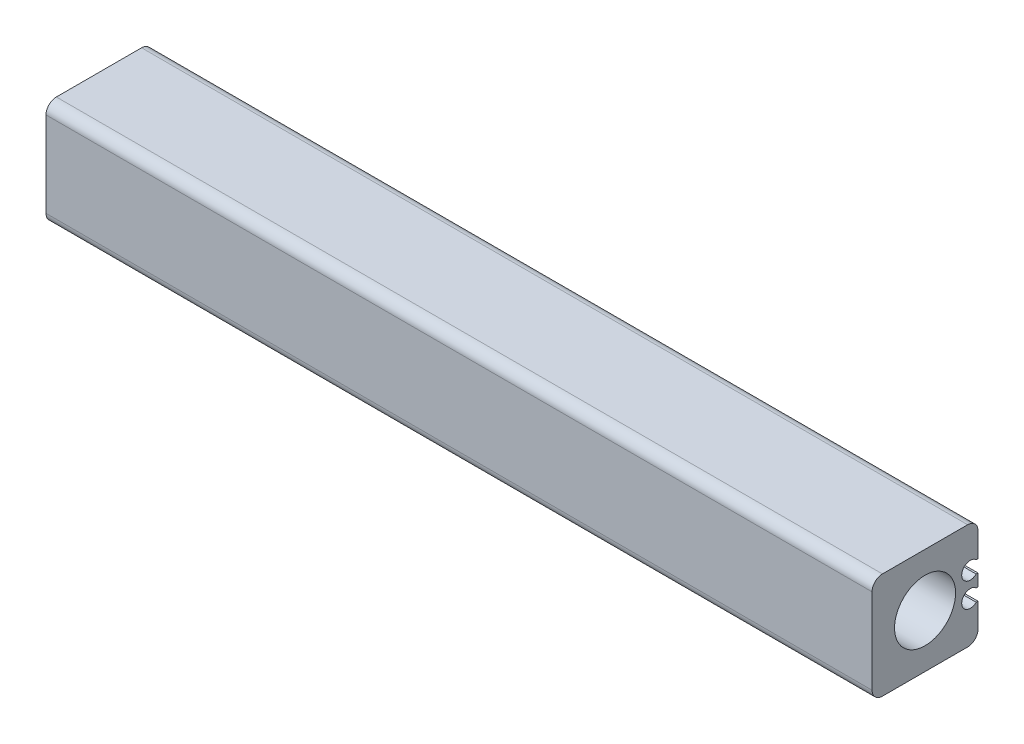
ISO-10303-21;
HEADER;
FILE_DESCRIPTION(('STEP AP214'),'2;1');
FILE_NAME('part.step','',(''),(''),'','','');
FILE_SCHEMA(('AUTOMOTIVE_DESIGN { 1 0 10303 214 1 1 1 1 }'));
ENDSEC;
DATA;
#1=APPLICATION_CONTEXT('core data for automotive mechanical design processes');
#2=APPLICATION_PROTOCOL_DEFINITION('international standard','automotive_design',2000,#1);
#3=PRODUCT_CONTEXT('',#1,'mechanical');
#4=PRODUCT('Part','Part','',(#3));
#5=PRODUCT_RELATED_PRODUCT_CATEGORY('part','',(#4));
#6=PRODUCT_DEFINITION_FORMATION('','',#4);
#7=PRODUCT_DEFINITION_CONTEXT('part definition',#1,'design');
#8=PRODUCT_DEFINITION('design','',#6,#7);
#9=PRODUCT_DEFINITION_SHAPE('','',#8);
#10=(LENGTH_UNIT() NAMED_UNIT(*) SI_UNIT(.MILLI.,.METRE.));
#11=(NAMED_UNIT(*) PLANE_ANGLE_UNIT() SI_UNIT($,.RADIAN.));
#12=(NAMED_UNIT(*) SI_UNIT($,.STERADIAN.) SOLID_ANGLE_UNIT());
#13=UNCERTAINTY_MEASURE_WITH_UNIT(LENGTH_MEASURE(1.E-05),#10,'distance_accuracy_value','');
#14=(GEOMETRIC_REPRESENTATION_CONTEXT(3) GLOBAL_UNCERTAINTY_ASSIGNED_CONTEXT((#13)) GLOBAL_UNIT_ASSIGNED_CONTEXT((#10,
#11,#12)) REPRESENTATION_CONTEXT('',''));
#15=CARTESIAN_POINT('',(0.,0.,0.));
#16=DIRECTION('',(0.,0.,1.));
#17=DIRECTION('',(1.,0.,0.));
#18=AXIS2_PLACEMENT_3D('',#15,#16,#17);
#19=CARTESIAN_POINT('',(101.393625,13.,-13.));
#20=DIRECTION('',(0.,0.,1.));
#21=DIRECTION('',(0.,-1.,0.));
#22=AXIS2_PLACEMENT_3D('',#19,#20,#21);
#23=PLANE('',#22);
#24=DIRECTION('',(0.,1.,0.));
#25=VECTOR('',#24,1.);
#26=CARTESIAN_POINT('',(-101.393625,13.,-13.));
#27=LINE('',#26,#25);
#28=CARTESIAN_POINT('',(-101.393625,-1.475,-13.));
#29=VERTEX_POINT('',#28);
#30=CARTESIAN_POINT('',(-101.393625,1.475,-13.));
#31=VERTEX_POINT('',#30);
#32=EDGE_CURVE('E308',#29,#31,#27,.T.);
#33=ORIENTED_EDGE('',*,*,#32,.T.);
#34=DIRECTION('',(-1.,0.,0.));
#35=VECTOR('',#34,1.);
#36=CARTESIAN_POINT('',(101.393625,1.475,-13.));
#37=LINE('',#36,#35);
#38=CARTESIAN_POINT('',(101.393625,1.475,-13.));
#39=VERTEX_POINT('',#38);
#40=EDGE_CURVE('E247',#39,#31,#37,.T.);
#41=ORIENTED_EDGE('',*,*,#40,.F.);
#42=DIRECTION('',(0.,1.,0.));
#43=VECTOR('',#42,1.);
#44=CARTESIAN_POINT('',(101.393625,13.,-13.));
#45=LINE('',#44,#43);
#46=CARTESIAN_POINT('',(101.393625,-1.475,-13.));
#47=VERTEX_POINT('',#46);
#48=EDGE_CURVE('E297',#47,#39,#45,.T.);
#49=ORIENTED_EDGE('',*,*,#48,.F.);
#50=DIRECTION('',(-1.,0.,0.));
#51=VECTOR('',#50,1.);
#52=CARTESIAN_POINT('',(101.393625,-1.475,-13.));
#53=LINE('',#52,#51);
#54=EDGE_CURVE('E276',#47,#29,#53,.T.);
#55=ORIENTED_EDGE('',*,*,#54,.T.);
#56=EDGE_LOOP('',(#33,#41,#49,#55));
#57=FACE_BOUND('',#56,.T.);
#58=ADVANCED_FACE('F16',(#57),#23,.F.);
#59=CARTESIAN_POINT('',(101.393625,-10.46,-13.));
#60=VERTEX_POINT('',#59);
#61=CARTESIAN_POINT('',(101.393625,-4.525,-13.));
#62=VERTEX_POINT('',#61);
#63=EDGE_CURVE('E294',#60,#62,#45,.T.);
#64=ORIENTED_EDGE('',*,*,#63,.F.);
#65=DIRECTION('',(-1.,0.,0.));
#66=VECTOR('',#65,1.);
#67=CARTESIAN_POINT('',(101.393625,-10.46,-13.));
#68=LINE('',#67,#66);
#69=CARTESIAN_POINT('',(-101.393625,-10.46,-13.));
#70=VERTEX_POINT('',#69);
#71=EDGE_CURVE('E334',#60,#70,#68,.T.);
#72=ORIENTED_EDGE('',*,*,#71,.T.);
#73=CARTESIAN_POINT('',(-101.393625,-4.525,-13.));
#74=VERTEX_POINT('',#73);
#75=EDGE_CURVE('E306',#70,#74,#27,.T.);
#76=ORIENTED_EDGE('',*,*,#75,.T.);
#77=DIRECTION('',(-1.,0.,0.));
#78=VECTOR('',#77,1.);
#79=CARTESIAN_POINT('',(101.393625,-4.525,-13.));
#80=LINE('',#79,#78);
#81=EDGE_CURVE('E273',#62,#74,#80,.T.);
#82=ORIENTED_EDGE('',*,*,#81,.F.);
#83=EDGE_LOOP('',(#64,#72,#76,#82));
#84=FACE_BOUND('',#83,.T.);
#85=ADVANCED_FACE('F372',(#84),#23,.F.);
#86=CARTESIAN_POINT('',(101.393625,13.,13.));
#87=DIRECTION('',(0.,0.,-1.));
#88=DIRECTION('',(0.,1.,0.));
#89=AXIS2_PLACEMENT_3D('',#86,#87,#88);
#90=PLANE('',#89);
#91=DIRECTION('',(0.,-1.,0.));
#92=VECTOR('',#91,1.);
#93=CARTESIAN_POINT('',(-101.393625,13.,13.));
#94=LINE('',#93,#92);
#95=CARTESIAN_POINT('',(-101.393625,10.46,13.));
#96=VERTEX_POINT('',#95);
#97=CARTESIAN_POINT('',(-101.393625,-10.46,13.));
#98=VERTEX_POINT('',#97);
#99=EDGE_CURVE('E284',#96,#98,#94,.T.);
#100=ORIENTED_EDGE('',*,*,#99,.T.);
#101=DIRECTION('',(-1.,0.,0.));
#102=VECTOR('',#101,1.);
#103=CARTESIAN_POINT('',(101.393625,-10.46,13.));
#104=LINE('',#103,#102);
#105=CARTESIAN_POINT('',(101.393625,-10.46,13.));
#106=VERTEX_POINT('',#105);
#107=EDGE_CURVE('E325',#98,#106,#104,.F.);
#108=ORIENTED_EDGE('',*,*,#107,.T.);
#109=DIRECTION('',(0.,-1.,0.));
#110=VECTOR('',#109,1.);
#111=CARTESIAN_POINT('',(101.393625,13.,13.));
#112=LINE('',#111,#110);
#113=CARTESIAN_POINT('',(101.393625,10.46,13.));
#114=VERTEX_POINT('',#113);
#115=EDGE_CURVE('E287',#114,#106,#112,.T.);
#116=ORIENTED_EDGE('',*,*,#115,.F.);
#117=DIRECTION('',(-1.,0.,0.));
#118=VECTOR('',#117,1.);
#119=CARTESIAN_POINT('',(101.393625,10.46,13.));
#120=LINE('',#119,#118);
#121=EDGE_CURVE('E322',#114,#96,#120,.T.);
#122=ORIENTED_EDGE('',*,*,#121,.T.);
#123=EDGE_LOOP('',(#100,#108,#116,#122));
#124=FACE_BOUND('',#123,.T.);
#125=ADVANCED_FACE('F354',(#124),#90,.F.);
#126=CARTESIAN_POINT('',(101.393625,-13.,13.));
#127=DIRECTION('',(0.,1.,0.));
#128=DIRECTION('',(0.,0.,1.));
#129=AXIS2_PLACEMENT_3D('',#126,#127,#128);
#130=PLANE('',#129);
#131=CARTESIAN_POINT('',(34.1207749999999,-13.,-7.5));
#132=DIRECTION('',(0.,-1.,0.));
#133=DIRECTION('',(0.,0.,-1.));
#134=AXIS2_PLACEMENT_3D('',#131,#132,#133);
#135=CIRCLE('',#134,1.25);
#136=CARTESIAN_POINT('',(34.1207749999999,-13.,-8.75));
#137=VERTEX_POINT('',#136);
#138=EDGE_CURVE('E164',#137,#137,#135,.T.);
#139=ORIENTED_EDGE('',*,*,#138,.F.);
#140=EDGE_LOOP('',(#139));
#141=FACE_BOUND('',#140,.T.);
#142=CARTESIAN_POINT('',(17.120775,-13.,-7.5));
#143=DIRECTION('',(0.,-1.,0.));
#144=DIRECTION('',(0.,0.,-1.));
#145=AXIS2_PLACEMENT_3D('',#142,#143,#144);
#146=CIRCLE('',#145,1.25);
#147=CARTESIAN_POINT('',(17.120775,-13.,-8.75));
#148=VERTEX_POINT('',#147);
#149=EDGE_CURVE('E176',#148,#148,#146,.T.);
#150=ORIENTED_EDGE('',*,*,#149,.F.);
#151=EDGE_LOOP('',(#150));
#152=FACE_BOUND('',#151,.T.);
#153=CARTESIAN_POINT('',(-85.393625,-13.,-7.5));
#154=DIRECTION('',(0.,-1.,0.));
#155=DIRECTION('',(0.,0.,-1.));
#156=AXIS2_PLACEMENT_3D('',#153,#154,#155);
#157=CIRCLE('',#156,1.25);
#158=CARTESIAN_POINT('',(-85.393625,-13.,-8.75));
#159=VERTEX_POINT('',#158);
#160=EDGE_CURVE('E188',#159,#159,#157,.T.);
#161=ORIENTED_EDGE('',*,*,#160,.F.);
#162=EDGE_LOOP('',(#161));
#163=FACE_BOUND('',#162,.T.);
#164=CARTESIAN_POINT('',(34.120775,-13.,8.5));
#165=DIRECTION('',(0.,-1.,0.));
#166=DIRECTION('',(0.,0.,-1.));
#167=AXIS2_PLACEMENT_3D('',#164,#165,#166);
#168=CIRCLE('',#167,1.25);
#169=CARTESIAN_POINT('',(34.120775,-13.,7.25));
#170=VERTEX_POINT('',#169);
#171=EDGE_CURVE('E200',#170,#170,#168,.T.);
#172=ORIENTED_EDGE('',*,*,#171,.F.);
#173=EDGE_LOOP('',(#172));
#174=FACE_BOUND('',#173,.T.);
#175=CARTESIAN_POINT('',(17.120775,-13.,8.5));
#176=DIRECTION('',(0.,-1.,0.));
#177=DIRECTION('',(0.,0.,-1.));
#178=AXIS2_PLACEMENT_3D('',#175,#176,#177);
#179=CIRCLE('',#178,1.25);
#180=CARTESIAN_POINT('',(17.120775,-13.,7.25));
#181=VERTEX_POINT('',#180);
#182=EDGE_CURVE('E212',#181,#181,#179,.T.);
#183=ORIENTED_EDGE('',*,*,#182,.F.);
#184=EDGE_LOOP('',(#183));
#185=FACE_BOUND('',#184,.T.);
#186=CARTESIAN_POINT('',(-85.393625,-13.,8.5));
#187=DIRECTION('',(0.,-1.,0.));
#188=DIRECTION('',(0.,0.,-1.));
#189=AXIS2_PLACEMENT_3D('',#186,#187,#188);
#190=CIRCLE('',#189,1.25);
#191=CARTESIAN_POINT('',(-85.393625,-13.,7.25));
#192=VERTEX_POINT('',#191);
#193=EDGE_CURVE('E224',#192,#192,#190,.T.);
#194=ORIENTED_EDGE('',*,*,#193,.F.);
#195=EDGE_LOOP('',(#194));
#196=FACE_BOUND('',#195,.T.);
#197=DIRECTION('',(0.,0.,-1.));
#198=VECTOR('',#197,1.);
#199=CARTESIAN_POINT('',(101.393625,-13.,13.));
#200=LINE('',#199,#198);
#201=CARTESIAN_POINT('',(101.393625,-13.,10.46));
#202=VERTEX_POINT('',#201);
#203=CARTESIAN_POINT('',(101.393625,-13.,-10.46));
#204=VERTEX_POINT('',#203);
#205=EDGE_CURVE('E290',#202,#204,#200,.T.);
#206=ORIENTED_EDGE('',*,*,#205,.F.);
#207=DIRECTION('',(-1.,0.,0.));
#208=VECTOR('',#207,1.);
#209=CARTESIAN_POINT('',(101.393625,-13.,10.46));
#210=LINE('',#209,#208);
#211=CARTESIAN_POINT('',(-101.393625,-13.,10.46));
#212=VERTEX_POINT('',#211);
#213=EDGE_CURVE('E311',#202,#212,#210,.T.);
#214=ORIENTED_EDGE('',*,*,#213,.T.);
#215=DIRECTION('',(0.,0.,-1.));
#216=VECTOR('',#215,1.);
#217=CARTESIAN_POINT('',(-101.393625,-13.,13.));
#218=LINE('',#217,#216);
#219=CARTESIAN_POINT('',(-101.393625,-13.,-10.46));
#220=VERTEX_POINT('',#219);
#221=EDGE_CURVE('E302',#212,#220,#218,.T.);
#222=ORIENTED_EDGE('',*,*,#221,.T.);
#223=DIRECTION('',(-1.,0.,0.));
#224=VECTOR('',#223,1.);
#225=CARTESIAN_POINT('',(101.393625,-13.,-10.46));
#226=LINE('',#225,#224);
#227=EDGE_CURVE('E299',#220,#204,#226,.F.);
#228=ORIENTED_EDGE('',*,*,#227,.T.);
#229=EDGE_LOOP('',(#206,#214,#222,#228));
#230=FACE_BOUND('',#229,.T.);
#231=ADVANCED_FACE('F364',(#141,#152,#163,#174,#185,#196,#230),#130,.F.);
#232=CARTESIAN_POINT('',(-101.393625,4.525,-13.));
#233=VERTEX_POINT('',#232);
#234=CARTESIAN_POINT('',(-101.393625,10.46,-13.));
#235=VERTEX_POINT('',#234);
#236=EDGE_CURVE('E305',#233,#235,#27,.T.);
#237=ORIENTED_EDGE('',*,*,#236,.T.);
#238=DIRECTION('',(-1.,0.,0.));
#239=VECTOR('',#238,1.);
#240=CARTESIAN_POINT('',(101.393625,10.46,-13.));
#241=LINE('',#240,#239);
#242=CARTESIAN_POINT('',(101.393625,10.46,-13.));
#243=VERTEX_POINT('',#242);
#244=EDGE_CURVE('E11',#235,#243,#241,.F.);
#245=ORIENTED_EDGE('',*,*,#244,.T.);
#246=CARTESIAN_POINT('',(101.393625,4.525,-13.));
#247=VERTEX_POINT('',#246);
#248=EDGE_CURVE('E293',#247,#243,#45,.T.);
#249=ORIENTED_EDGE('',*,*,#248,.F.);
#250=DIRECTION('',(-1.,0.,0.));
#251=VECTOR('',#250,1.);
#252=CARTESIAN_POINT('',(101.393625,4.525,-13.));
#253=LINE('',#252,#251);
#254=EDGE_CURVE('E249',#247,#233,#253,.T.);
#255=ORIENTED_EDGE('',*,*,#254,.T.);
#256=EDGE_LOOP('',(#237,#245,#249,#255));
#257=FACE_BOUND('',#256,.T.);
#258=ADVANCED_FACE('F395',(#257),#23,.F.);
#259=CARTESIAN_POINT('',(101.393625,13.,13.));
#260=DIRECTION('',(0.,-1.,0.));
#261=DIRECTION('',(0.,0.,-1.));
#262=AXIS2_PLACEMENT_3D('',#259,#260,#261);
#263=PLANE('',#262);
#264=DIRECTION('',(0.,0.,1.));
#265=VECTOR('',#264,1.);
#266=CARTESIAN_POINT('',(101.393625,13.,13.));
#267=LINE('',#266,#265);
#268=CARTESIAN_POINT('',(101.393625,13.,-10.46));
#269=VERTEX_POINT('',#268);
#270=CARTESIAN_POINT('',(101.393625,13.,10.46));
#271=VERTEX_POINT('',#270);
#272=EDGE_CURVE('E296',#269,#271,#267,.T.);
#273=ORIENTED_EDGE('',*,*,#272,.F.);
#274=DIRECTION('',(-1.,0.,0.));
#275=VECTOR('',#274,1.);
#276=CARTESIAN_POINT('',(101.393625,13.,-10.46));
#277=LINE('',#276,#275);
#278=CARTESIAN_POINT('',(-101.393625,13.,-10.46));
#279=VERTEX_POINT('',#278);
#280=EDGE_CURVE('E24',#269,#279,#277,.T.);
#281=ORIENTED_EDGE('',*,*,#280,.T.);
#282=DIRECTION('',(0.,0.,1.));
#283=VECTOR('',#282,1.);
#284=CARTESIAN_POINT('',(-101.393625,13.,13.));
#285=LINE('',#284,#283);
#286=CARTESIAN_POINT('',(-101.393625,13.,10.46));
#287=VERTEX_POINT('',#286);
#288=EDGE_CURVE('E291',#279,#287,#285,.T.);
#289=ORIENTED_EDGE('',*,*,#288,.T.);
#290=DIRECTION('',(-1.,0.,0.));
#291=VECTOR('',#290,1.);
#292=CARTESIAN_POINT('',(101.393625,13.,10.46));
#293=LINE('',#292,#291);
#294=EDGE_CURVE('E39',#287,#271,#293,.F.);
#295=ORIENTED_EDGE('',*,*,#294,.T.);
#296=EDGE_LOOP('',(#273,#281,#289,#295));
#297=FACE_BOUND('',#296,.T.);
#298=ADVANCED_FACE('F340',(#297),#263,.F.);
#299=CARTESIAN_POINT('',(101.393625,-13.,13.));
#300=DIRECTION('',(1.,0.,0.));
#301=DIRECTION('',(0.,0.,-1.));
#302=AXIS2_PLACEMENT_3D('',#299,#300,#301);
#303=PLANE('',#302);
#304=ORIENTED_EDGE('',*,*,#115,.T.);
#305=CARTESIAN_POINT('',(101.393625,-10.46,10.46));
#306=DIRECTION('',(1.,0.,0.));
#307=DIRECTION('',(0.,0.,-1.));
#308=AXIS2_PLACEMENT_3D('',#305,#306,#307);
#309=CIRCLE('',#308,2.54);
#310=EDGE_CURVE('E332',#106,#202,#309,.T.);
#311=ORIENTED_EDGE('',*,*,#310,.T.);
#312=ORIENTED_EDGE('',*,*,#205,.T.);
#313=CARTESIAN_POINT('',(101.393625,-10.46,-10.46));
#314=DIRECTION('',(1.,0.,0.));
#315=DIRECTION('',(0.,0.,-1.));
#316=AXIS2_PLACEMENT_3D('',#313,#314,#315);
#317=CIRCLE('',#316,2.54);
#318=EDGE_CURVE('E31',#204,#60,#317,.T.);
#319=ORIENTED_EDGE('',*,*,#318,.T.);
#320=ORIENTED_EDGE('',*,*,#63,.T.);
#321=DIRECTION('',(0.,0.,1.));
#322=VECTOR('',#321,1.);
#323=CARTESIAN_POINT('',(101.393625,-4.525,-13.));
#324=LINE('',#323,#322);
#325=CARTESIAN_POINT('',(101.393625,-4.525,-12.5437364717981));
#326=VERTEX_POINT('',#325);
#327=EDGE_CURVE('E261',#62,#326,#324,.T.);
#328=ORIENTED_EDGE('',*,*,#327,.T.);
#329=CARTESIAN_POINT('',(101.393625,-3.,-11.1));
#330=DIRECTION('',(-1.,0.,0.));
#331=DIRECTION('',(0.,0.,1.));
#332=AXIS2_PLACEMENT_3D('',#329,#330,#331);
#333=CIRCLE('',#332,2.1);
#334=CARTESIAN_POINT('',(101.393625,-1.475,-12.5437364717981));
#335=VERTEX_POINT('',#334);
#336=EDGE_CURVE('E254',#326,#335,#333,.T.);
#337=ORIENTED_EDGE('',*,*,#336,.T.);
#338=DIRECTION('',(0.,0.,-1.));
#339=VECTOR('',#338,1.);
#340=CARTESIAN_POINT('',(101.393625,-1.475,-13.));
#341=LINE('',#340,#339);
#342=EDGE_CURVE('E257',#335,#47,#341,.T.);
#343=ORIENTED_EDGE('',*,*,#342,.T.);
#344=ORIENTED_EDGE('',*,*,#48,.T.);
#345=DIRECTION('',(0.,0.,1.));
#346=VECTOR('',#345,1.);
#347=CARTESIAN_POINT('',(101.393625,1.475,-13.));
#348=LINE('',#347,#346);
#349=CARTESIAN_POINT('',(101.393625,1.475,-12.5437364717981));
#350=VERTEX_POINT('',#349);
#351=EDGE_CURVE('E235',#39,#350,#348,.T.);
#352=ORIENTED_EDGE('',*,*,#351,.T.);
#353=CARTESIAN_POINT('',(101.393625,3.,-11.1));
#354=DIRECTION('',(-1.,0.,0.));
#355=DIRECTION('',(0.,0.,1.));
#356=AXIS2_PLACEMENT_3D('',#353,#354,#355);
#357=CIRCLE('',#356,2.1);
#358=CARTESIAN_POINT('',(101.393625,4.525,-12.5437364717981));
#359=VERTEX_POINT('',#358);
#360=EDGE_CURVE('E228',#350,#359,#357,.T.);
#361=ORIENTED_EDGE('',*,*,#360,.T.);
#362=DIRECTION('',(0.,0.,-1.));
#363=VECTOR('',#362,1.);
#364=CARTESIAN_POINT('',(101.393625,4.525,-13.));
#365=LINE('',#364,#363);
#366=EDGE_CURVE('E231',#359,#247,#365,.T.);
#367=ORIENTED_EDGE('',*,*,#366,.T.);
#368=ORIENTED_EDGE('',*,*,#248,.T.);
#369=CARTESIAN_POINT('',(101.393625,10.46,-10.46));
#370=DIRECTION('',(1.,0.,0.));
#371=DIRECTION('',(0.,0.,-1.));
#372=AXIS2_PLACEMENT_3D('',#369,#370,#371);
#373=CIRCLE('',#372,2.54);
#374=EDGE_CURVE('E329',#243,#269,#373,.T.);
#375=ORIENTED_EDGE('',*,*,#374,.T.);
#376=ORIENTED_EDGE('',*,*,#272,.T.);
#377=CARTESIAN_POINT('',(101.393625,10.46,10.46));
#378=DIRECTION('',(1.,0.,0.));
#379=DIRECTION('',(0.,0.,-1.));
#380=AXIS2_PLACEMENT_3D('',#377,#378,#379);
#381=CIRCLE('',#380,2.54);
#382=EDGE_CURVE('E327',#271,#114,#381,.T.);
#383=ORIENTED_EDGE('',*,*,#382,.T.);
#384=EDGE_LOOP('',(#304,#311,#312,#319,#320,#328,#337,#343,#344,#352,#361,#367,#368,#375,#376,#383));
#385=FACE_BOUND('',#384,.T.);
#386=CARTESIAN_POINT('',(101.393625,0.,0.));
#387=DIRECTION('',(1.,0.,0.));
#388=DIRECTION('',(0.,0.,-1.));
#389=AXIS2_PLACEMENT_3D('',#386,#387,#388);
#390=CIRCLE('',#389,7.493);
#391=CARTESIAN_POINT('',(101.393625,0.,-7.493));
#392=VERTEX_POINT('',#391);
#393=EDGE_CURVE('E272',#392,#392,#390,.T.);
#394=ORIENTED_EDGE('',*,*,#393,.F.);
#395=EDGE_LOOP('',(#394));
#396=FACE_BOUND('',#395,.T.);
#397=ADVANCED_FACE('F357',(#385,#396),#303,.T.);
#398=CARTESIAN_POINT('',(-101.393625,-13.,13.));
#399=DIRECTION('',(1.,0.,0.));
#400=DIRECTION('',(0.,0.,-1.));
#401=AXIS2_PLACEMENT_3D('',#398,#399,#400);
#402=PLANE('',#401);
#403=CARTESIAN_POINT('',(-101.393625,0.,0.));
#404=DIRECTION('',(1.,0.,0.));
#405=DIRECTION('',(0.,0.,-1.));
#406=AXIS2_PLACEMENT_3D('',#403,#404,#405);
#407=CIRCLE('',#406,7.493);
#408=CARTESIAN_POINT('',(-101.393625,0.,-7.493));
#409=VERTEX_POINT('',#408);
#410=EDGE_CURVE('E281',#409,#409,#407,.T.);
#411=ORIENTED_EDGE('',*,*,#410,.T.);
#412=EDGE_LOOP('',(#411));
#413=FACE_BOUND('',#412,.T.);
#414=ORIENTED_EDGE('',*,*,#221,.F.);
#415=CARTESIAN_POINT('',(-101.393625,-10.46,10.46));
#416=DIRECTION('',(1.,0.,0.));
#417=DIRECTION('',(0.,0.,-1.));
#418=AXIS2_PLACEMENT_3D('',#415,#416,#417);
#419=CIRCLE('',#418,2.54);
#420=EDGE_CURVE('E320',#212,#98,#419,.F.);
#421=ORIENTED_EDGE('',*,*,#420,.T.);
#422=ORIENTED_EDGE('',*,*,#99,.F.);
#423=CARTESIAN_POINT('',(-101.393625,10.46,10.46));
#424=DIRECTION('',(1.,0.,0.));
#425=DIRECTION('',(0.,0.,-1.));
#426=AXIS2_PLACEMENT_3D('',#423,#424,#425);
#427=CIRCLE('',#426,2.54);
#428=EDGE_CURVE('E314',#96,#287,#427,.F.);
#429=ORIENTED_EDGE('',*,*,#428,.T.);
#430=ORIENTED_EDGE('',*,*,#288,.F.);
#431=CARTESIAN_POINT('',(-101.393625,10.46,-10.46));
#432=DIRECTION('',(1.,0.,0.));
#433=DIRECTION('',(0.,0.,-1.));
#434=AXIS2_PLACEMENT_3D('',#431,#432,#433);
#435=CIRCLE('',#434,2.54);
#436=EDGE_CURVE('E316',#279,#235,#435,.F.);
#437=ORIENTED_EDGE('',*,*,#436,.T.);
#438=ORIENTED_EDGE('',*,*,#236,.F.);
#439=DIRECTION('',(0.,0.,-1.));
#440=VECTOR('',#439,1.);
#441=CARTESIAN_POINT('',(-101.393625,4.525,-13.));
#442=LINE('',#441,#440);
#443=CARTESIAN_POINT('',(-101.393625,4.525,-12.5437364717981));
#444=VERTEX_POINT('',#443);
#445=EDGE_CURVE('E240',#444,#233,#442,.T.);
#446=ORIENTED_EDGE('',*,*,#445,.F.);
#447=CARTESIAN_POINT('',(-101.393625,3.,-11.1));
#448=DIRECTION('',(-1.,0.,0.));
#449=DIRECTION('',(0.,0.,1.));
#450=AXIS2_PLACEMENT_3D('',#447,#448,#449);
#451=CIRCLE('',#450,2.1);
#452=CARTESIAN_POINT('',(-101.393625,1.475,-12.5437364717981));
#453=VERTEX_POINT('',#452);
#454=EDGE_CURVE('E227',#453,#444,#451,.T.);
#455=ORIENTED_EDGE('',*,*,#454,.F.);
#456=DIRECTION('',(0.,0.,1.));
#457=VECTOR('',#456,1.);
#458=CARTESIAN_POINT('',(-101.393625,1.475,-13.));
#459=LINE('',#458,#457);
#460=EDGE_CURVE('E232',#31,#453,#459,.T.);
#461=ORIENTED_EDGE('',*,*,#460,.F.);
#462=ORIENTED_EDGE('',*,*,#32,.F.);
#463=DIRECTION('',(0.,0.,-1.));
#464=VECTOR('',#463,1.);
#465=CARTESIAN_POINT('',(-101.393625,-1.475,-13.));
#466=LINE('',#465,#464);
#467=CARTESIAN_POINT('',(-101.393625,-1.475,-12.5437364717981));
#468=VERTEX_POINT('',#467);
#469=EDGE_CURVE('E266',#468,#29,#466,.T.);
#470=ORIENTED_EDGE('',*,*,#469,.F.);
#471=CARTESIAN_POINT('',(-101.393625,-3.,-11.1));
#472=DIRECTION('',(-1.,0.,0.));
#473=DIRECTION('',(0.,0.,1.));
#474=AXIS2_PLACEMENT_3D('',#471,#472,#473);
#475=CIRCLE('',#474,2.1);
#476=CARTESIAN_POINT('',(-101.393625,-4.525,-12.5437364717981));
#477=VERTEX_POINT('',#476);
#478=EDGE_CURVE('E246',#477,#468,#475,.T.);
#479=ORIENTED_EDGE('',*,*,#478,.F.);
#480=DIRECTION('',(0.,0.,1.));
#481=VECTOR('',#480,1.);
#482=CARTESIAN_POINT('',(-101.393625,-4.525,-13.));
#483=LINE('',#482,#481);
#484=EDGE_CURVE('E258',#74,#477,#483,.T.);
#485=ORIENTED_EDGE('',*,*,#484,.F.);
#486=ORIENTED_EDGE('',*,*,#75,.F.);
#487=CARTESIAN_POINT('',(-101.393625,-10.46,-10.46));
#488=DIRECTION('',(1.,0.,0.));
#489=DIRECTION('',(0.,0.,-1.));
#490=AXIS2_PLACEMENT_3D('',#487,#488,#489);
#491=CIRCLE('',#490,2.54);
#492=EDGE_CURVE('E318',#70,#220,#491,.F.);
#493=ORIENTED_EDGE('',*,*,#492,.T.);
#494=EDGE_LOOP('',(#414,#421,#422,#429,#430,#437,#438,#446,#455,#461,#462,#470,#479,#485,#486,#493));
#495=FACE_BOUND('',#494,.T.);
#496=ADVANCED_FACE('F345',(#413,#495),#402,.F.);
#497=CARTESIAN_POINT('',(-101.393625,0.,0.));
#498=DIRECTION('',(1.,0.,0.));
#499=DIRECTION('',(0.,0.,-1.));
#500=AXIS2_PLACEMENT_3D('',#497,#498,#499);
#501=CYLINDRICAL_SURFACE('',#500,7.493);
#502=ORIENTED_EDGE('',*,*,#410,.F.);
#503=EDGE_LOOP('',(#502));
#504=FACE_BOUND('',#503,.T.);
#505=ORIENTED_EDGE('',*,*,#393,.T.);
#506=EDGE_LOOP('',(#505));
#507=FACE_BOUND('',#506,.T.);
#508=ADVANCED_FACE('F753',(#504,#507),#501,.F.);
#509=CARTESIAN_POINT('',(101.393625,-3.,-11.1));
#510=DIRECTION('',(-1.,0.,0.));
#511=DIRECTION('',(0.,0.,1.));
#512=AXIS2_PLACEMENT_3D('',#509,#510,#511);
#513=CYLINDRICAL_SURFACE('',#512,2.1);
#514=ORIENTED_EDGE('',*,*,#478,.T.);
#515=DIRECTION('',(-1.,0.,0.));
#516=VECTOR('',#515,1.);
#517=CARTESIAN_POINT('',(101.393625,-1.475,-12.5437364717981));
#518=LINE('',#517,#516);
#519=EDGE_CURVE('E264',#335,#468,#518,.T.);
#520=ORIENTED_EDGE('',*,*,#519,.F.);
#521=ORIENTED_EDGE('',*,*,#336,.F.);
#522=DIRECTION('',(-1.,0.,0.));
#523=VECTOR('',#522,1.);
#524=CARTESIAN_POINT('',(101.393625,-4.525,-12.5437364717981));
#525=LINE('',#524,#523);
#526=EDGE_CURVE('E270',#326,#477,#525,.T.);
#527=ORIENTED_EDGE('',*,*,#526,.T.);
#528=EDGE_LOOP('',(#514,#520,#521,#527));
#529=FACE_BOUND('',#528,.T.);
#530=ADVANCED_FACE('F380',(#529),#513,.F.);
#531=CARTESIAN_POINT('',(101.393625,-4.525,-13.));
#532=DIRECTION('',(0.,-1.,0.));
#533=DIRECTION('',(0.,0.,-1.));
#534=AXIS2_PLACEMENT_3D('',#531,#532,#533);
#535=PLANE('',#534);
#536=ORIENTED_EDGE('',*,*,#484,.T.);
#537=ORIENTED_EDGE('',*,*,#526,.F.);
#538=ORIENTED_EDGE('',*,*,#327,.F.);
#539=ORIENTED_EDGE('',*,*,#81,.T.);
#540=EDGE_LOOP('',(#536,#537,#538,#539));
#541=FACE_BOUND('',#540,.T.);
#542=ADVANCED_FACE('F376',(#541),#535,.F.);
#543=CARTESIAN_POINT('',(101.393625,-1.475,-13.));
#544=DIRECTION('',(0.,1.,0.));
#545=DIRECTION('',(0.,0.,1.));
#546=AXIS2_PLACEMENT_3D('',#543,#544,#545);
#547=PLANE('',#546);
#548=ORIENTED_EDGE('',*,*,#469,.T.);
#549=ORIENTED_EDGE('',*,*,#54,.F.);
#550=ORIENTED_EDGE('',*,*,#342,.F.);
#551=ORIENTED_EDGE('',*,*,#519,.T.);
#552=EDGE_LOOP('',(#548,#549,#550,#551));
#553=FACE_BOUND('',#552,.T.);
#554=ADVANCED_FACE('F732',(#553),#547,.F.);
#555=CARTESIAN_POINT('',(101.393625,3.,-11.1));
#556=DIRECTION('',(-1.,0.,0.));
#557=DIRECTION('',(0.,0.,1.));
#558=AXIS2_PLACEMENT_3D('',#555,#556,#557);
#559=CYLINDRICAL_SURFACE('',#558,2.1);
#560=ORIENTED_EDGE('',*,*,#454,.T.);
#561=DIRECTION('',(-1.,0.,0.));
#562=VECTOR('',#561,1.);
#563=CARTESIAN_POINT('',(101.393625,4.525,-12.5437364717981));
#564=LINE('',#563,#562);
#565=EDGE_CURVE('E238',#359,#444,#564,.T.);
#566=ORIENTED_EDGE('',*,*,#565,.F.);
#567=ORIENTED_EDGE('',*,*,#360,.F.);
#568=DIRECTION('',(-1.,0.,0.));
#569=VECTOR('',#568,1.);
#570=CARTESIAN_POINT('',(101.393625,1.475,-12.5437364717981));
#571=LINE('',#570,#569);
#572=EDGE_CURVE('E244',#350,#453,#571,.T.);
#573=ORIENTED_EDGE('',*,*,#572,.T.);
#574=EDGE_LOOP('',(#560,#566,#567,#573));
#575=FACE_BOUND('',#574,.T.);
#576=ADVANCED_FACE('F404',(#575),#559,.F.);
#577=CARTESIAN_POINT('',(101.393625,1.475,-13.));
#578=DIRECTION('',(0.,-1.,0.));
#579=DIRECTION('',(0.,0.,-1.));
#580=AXIS2_PLACEMENT_3D('',#577,#578,#579);
#581=PLANE('',#580);
#582=ORIENTED_EDGE('',*,*,#460,.T.);
#583=ORIENTED_EDGE('',*,*,#572,.F.);
#584=ORIENTED_EDGE('',*,*,#351,.F.);
#585=ORIENTED_EDGE('',*,*,#40,.T.);
#586=EDGE_LOOP('',(#582,#583,#584,#585));
#587=FACE_BOUND('',#586,.T.);
#588=ADVANCED_FACE('F401',(#587),#581,.F.);
#589=CARTESIAN_POINT('',(101.393625,4.525,-13.));
#590=DIRECTION('',(0.,1.,0.));
#591=DIRECTION('',(0.,0.,1.));
#592=AXIS2_PLACEMENT_3D('',#589,#590,#591);
#593=PLANE('',#592);
#594=ORIENTED_EDGE('',*,*,#445,.T.);
#595=ORIENTED_EDGE('',*,*,#254,.F.);
#596=ORIENTED_EDGE('',*,*,#366,.F.);
#597=ORIENTED_EDGE('',*,*,#565,.T.);
#598=EDGE_LOOP('',(#594,#595,#596,#597));
#599=FACE_BOUND('',#598,.T.);
#600=ADVANCED_FACE('F406',(#599),#593,.F.);
#601=CARTESIAN_POINT('',(101.393625,-10.46,10.46));
#602=DIRECTION('',(-1.,0.,0.));
#603=DIRECTION('',(0.,0.,1.));
#604=AXIS2_PLACEMENT_3D('',#601,#602,#603);
#605=CYLINDRICAL_SURFACE('',#604,2.54);
#606=ORIENTED_EDGE('',*,*,#310,.F.);
#607=ORIENTED_EDGE('',*,*,#107,.F.);
#608=ORIENTED_EDGE('',*,*,#420,.F.);
#609=ORIENTED_EDGE('',*,*,#213,.F.);
#610=EDGE_LOOP('',(#606,#607,#608,#609));
#611=FACE_BOUND('',#610,.T.);
#612=ADVANCED_FACE('F362',(#611),#605,.T.);
#613=CARTESIAN_POINT('',(101.393625,-10.46,-10.46));
#614=DIRECTION('',(-1.,0.,0.));
#615=DIRECTION('',(0.,0.,1.));
#616=AXIS2_PLACEMENT_3D('',#613,#614,#615);
#617=CYLINDRICAL_SURFACE('',#616,2.54);
#618=ORIENTED_EDGE('',*,*,#318,.F.);
#619=ORIENTED_EDGE('',*,*,#227,.F.);
#620=ORIENTED_EDGE('',*,*,#492,.F.);
#621=ORIENTED_EDGE('',*,*,#71,.F.);
#622=EDGE_LOOP('',(#618,#619,#620,#621));
#623=FACE_BOUND('',#622,.T.);
#624=ADVANCED_FACE('F370',(#623),#617,.T.);
#625=CARTESIAN_POINT('',(101.393625,10.46,-10.46));
#626=DIRECTION('',(-1.,0.,0.));
#627=DIRECTION('',(0.,0.,1.));
#628=AXIS2_PLACEMENT_3D('',#625,#626,#627);
#629=CYLINDRICAL_SURFACE('',#628,2.54);
#630=ORIENTED_EDGE('',*,*,#374,.F.);
#631=ORIENTED_EDGE('',*,*,#244,.F.);
#632=ORIENTED_EDGE('',*,*,#436,.F.);
#633=ORIENTED_EDGE('',*,*,#280,.F.);
#634=EDGE_LOOP('',(#630,#631,#632,#633));
#635=FACE_BOUND('',#634,.T.);
#636=ADVANCED_FACE('F394',(#635),#629,.T.);
#637=CARTESIAN_POINT('',(101.393625,10.46,10.46));
#638=DIRECTION('',(-1.,0.,0.));
#639=DIRECTION('',(0.,0.,1.));
#640=AXIS2_PLACEMENT_3D('',#637,#638,#639);
#641=CYLINDRICAL_SURFACE('',#640,2.54);
#642=ORIENTED_EDGE('',*,*,#382,.F.);
#643=ORIENTED_EDGE('',*,*,#294,.F.);
#644=ORIENTED_EDGE('',*,*,#428,.F.);
#645=ORIENTED_EDGE('',*,*,#121,.F.);
#646=EDGE_LOOP('',(#642,#643,#644,#645));
#647=FACE_BOUND('',#646,.T.);
#648=ADVANCED_FACE('F18',(#647),#641,.T.);
#649=CARTESIAN_POINT('',(-85.393625,-13.,8.5));
#650=DIRECTION('',(0.,-1.,0.));
#651=DIRECTION('',(0.,0.,-1.));
#652=AXIS2_PLACEMENT_3D('',#649,#650,#651);
#653=CYLINDRICAL_SURFACE('',#652,1.25);
#654=CARTESIAN_POINT('',(-85.393625,-7.99619999999999,8.5));
#655=DIRECTION('',(0.,-1.,0.));
#656=DIRECTION('',(0.,0.,-1.));
#657=AXIS2_PLACEMENT_3D('',#654,#655,#656);
#658=CIRCLE('',#657,1.25);
#659=CARTESIAN_POINT('',(-85.393625,-7.99619999999999,7.25));
#660=VERTEX_POINT('',#659);
#661=EDGE_CURVE('E221',#660,#660,#658,.T.);
#662=ORIENTED_EDGE('',*,*,#661,.F.);
#663=EDGE_LOOP('',(#662));
#664=FACE_BOUND('',#663,.T.);
#665=ORIENTED_EDGE('',*,*,#193,.T.);
#666=EDGE_LOOP('',(#665));
#667=FACE_BOUND('',#666,.T.);
#668=ADVANCED_FACE('F442',(#664,#667),#653,.F.);
#669=CARTESIAN_POINT('',(-84.368625,-7.99619999999999,8.5));
#670=DIRECTION('',(0.,1.,0.));
#671=DIRECTION('',(0.,0.,1.));
#672=AXIS2_PLACEMENT_3D('',#669,#670,#671);
#673=PLANE('',#672);
#674=CARTESIAN_POINT('',(-85.393625,-7.99619999999999,8.5));
#675=DIRECTION('',(0.,-1.,0.));
#676=DIRECTION('',(0.,0.,-1.));
#677=AXIS2_PLACEMENT_3D('',#674,#675,#676);
#678=CIRCLE('',#677,1.025);
#679=CARTESIAN_POINT('',(-85.393625,-7.99619999999999,7.475));
#680=VERTEX_POINT('',#679);
#681=EDGE_CURVE('E218',#680,#680,#678,.T.);
#682=ORIENTED_EDGE('',*,*,#681,.F.);
#683=EDGE_LOOP('',(#682));
#684=FACE_BOUND('',#683,.T.);
#685=ORIENTED_EDGE('',*,*,#661,.T.);
#686=EDGE_LOOP('',(#685));
#687=FACE_BOUND('',#686,.T.);
#688=ADVANCED_FACE('F446',(#684,#687),#673,.F.);
#689=CARTESIAN_POINT('',(-85.393625,-13.,8.5));
#690=DIRECTION('',(0.,-1.,0.));
#691=DIRECTION('',(0.,0.,-1.));
#692=AXIS2_PLACEMENT_3D('',#689,#690,#691);
#693=CYLINDRICAL_SURFACE('',#692,1.025);
#694=CARTESIAN_POINT('',(-85.393625,-5.7356,8.5));
#695=DIRECTION('',(0.,-1.,0.));
#696=DIRECTION('',(0.,0.,-1.));
#697=AXIS2_PLACEMENT_3D('',#694,#695,#696);
#698=CIRCLE('',#697,1.025);
#699=CARTESIAN_POINT('',(-85.393625,-5.7356,7.475));
#700=VERTEX_POINT('',#699);
#701=EDGE_CURVE('E215',#700,#700,#698,.T.);
#702=ORIENTED_EDGE('',*,*,#701,.F.);
#703=EDGE_LOOP('',(#702));
#704=FACE_BOUND('',#703,.T.);
#705=ORIENTED_EDGE('',*,*,#681,.T.);
#706=EDGE_LOOP('',(#705));
#707=FACE_BOUND('',#706,.T.);
#708=ADVANCED_FACE('F452',(#704,#707),#693,.F.);
#709=CARTESIAN_POINT('',(-85.393625,-5.7356,8.5));
#710=DIRECTION('',(0.,-1.,0.));
#711=DIRECTION('',(0.,0.,-1.));
#712=AXIS2_PLACEMENT_3D('',#709,#710,#711);
#713=CONICAL_SURFACE('',#712,1.025,1.02974425867665);
#714=CARTESIAN_POINT('',(-85.393625,-5.11971786549675,8.5));
#715=VERTEX_POINT('',#714);
#716=VERTEX_LOOP('',#715);
#717=FACE_BOUND('',#716,.T.);
#718=ORIENTED_EDGE('',*,*,#701,.T.);
#719=EDGE_LOOP('',(#718));
#720=FACE_BOUND('',#719,.T.);
#721=ADVANCED_FACE('F460',(#717,#720),#713,.F.);
#722=CARTESIAN_POINT('',(17.120775,-13.,8.5));
#723=DIRECTION('',(0.,-1.,0.));
#724=DIRECTION('',(0.,0.,-1.));
#725=AXIS2_PLACEMENT_3D('',#722,#723,#724);
#726=CYLINDRICAL_SURFACE('',#725,1.25);
#727=CARTESIAN_POINT('',(17.120775,-7.99619999999999,8.5));
#728=DIRECTION('',(0.,-1.,0.));
#729=DIRECTION('',(0.,0.,-1.));
#730=AXIS2_PLACEMENT_3D('',#727,#728,#729);
#731=CIRCLE('',#730,1.25);
#732=CARTESIAN_POINT('',(17.120775,-7.99619999999999,7.25));
#733=VERTEX_POINT('',#732);
#734=EDGE_CURVE('E209',#733,#733,#731,.T.);
#735=ORIENTED_EDGE('',*,*,#734,.F.);
#736=EDGE_LOOP('',(#735));
#737=FACE_BOUND('',#736,.T.);
#738=ORIENTED_EDGE('',*,*,#182,.T.);
#739=EDGE_LOOP('',(#738));
#740=FACE_BOUND('',#739,.T.);
#741=ADVANCED_FACE('F464',(#737,#740),#726,.F.);
#742=CARTESIAN_POINT('',(18.145775,-7.99619999999999,8.5));
#743=DIRECTION('',(0.,1.,0.));
#744=DIRECTION('',(0.,0.,1.));
#745=AXIS2_PLACEMENT_3D('',#742,#743,#744);
#746=PLANE('',#745);
#747=CARTESIAN_POINT('',(17.120775,-7.99619999999999,8.5));
#748=DIRECTION('',(0.,-1.,0.));
#749=DIRECTION('',(0.,0.,-1.));
#750=AXIS2_PLACEMENT_3D('',#747,#748,#749);
#751=CIRCLE('',#750,1.025);
#752=CARTESIAN_POINT('',(17.120775,-7.99619999999999,7.475));
#753=VERTEX_POINT('',#752);
#754=EDGE_CURVE('E206',#753,#753,#751,.T.);
#755=ORIENTED_EDGE('',*,*,#754,.F.);
#756=EDGE_LOOP('',(#755));
#757=FACE_BOUND('',#756,.T.);
#758=ORIENTED_EDGE('',*,*,#734,.T.);
#759=EDGE_LOOP('',(#758));
#760=FACE_BOUND('',#759,.T.);
#761=ADVANCED_FACE('F468',(#757,#760),#746,.F.);
#762=CARTESIAN_POINT('',(17.120775,-13.,8.5));
#763=DIRECTION('',(0.,-1.,0.));
#764=DIRECTION('',(0.,0.,-1.));
#765=AXIS2_PLACEMENT_3D('',#762,#763,#764);
#766=CYLINDRICAL_SURFACE('',#765,1.025);
#767=CARTESIAN_POINT('',(17.120775,-5.7356,8.5));
#768=DIRECTION('',(0.,-1.,0.));
#769=DIRECTION('',(0.,0.,-1.));
#770=AXIS2_PLACEMENT_3D('',#767,#768,#769);
#771=CIRCLE('',#770,1.025);
#772=CARTESIAN_POINT('',(17.120775,-5.7356,7.475));
#773=VERTEX_POINT('',#772);
#774=EDGE_CURVE('E203',#773,#773,#771,.T.);
#775=ORIENTED_EDGE('',*,*,#774,.F.);
#776=EDGE_LOOP('',(#775));
#777=FACE_BOUND('',#776,.T.);
#778=ORIENTED_EDGE('',*,*,#754,.T.);
#779=EDGE_LOOP('',(#778));
#780=FACE_BOUND('',#779,.T.);
#781=ADVANCED_FACE('F472',(#777,#780),#766,.F.);
#782=CARTESIAN_POINT('',(17.120775,-5.7356,8.5));
#783=DIRECTION('',(0.,-1.,0.));
#784=DIRECTION('',(0.,0.,-1.));
#785=AXIS2_PLACEMENT_3D('',#782,#783,#784);
#786=CONICAL_SURFACE('',#785,1.025,1.02974425867665);
#787=CARTESIAN_POINT('',(17.120775,-5.11971786549675,8.5));
#788=VERTEX_POINT('',#787);
#789=VERTEX_LOOP('',#788);
#790=FACE_BOUND('',#789,.T.);
#791=ORIENTED_EDGE('',*,*,#774,.T.);
#792=EDGE_LOOP('',(#791));
#793=FACE_BOUND('',#792,.T.);
#794=ADVANCED_FACE('F476',(#790,#793),#786,.F.);
#795=CARTESIAN_POINT('',(34.120775,-13.,8.5));
#796=DIRECTION('',(0.,-1.,0.));
#797=DIRECTION('',(0.,0.,-1.));
#798=AXIS2_PLACEMENT_3D('',#795,#796,#797);
#799=CYLINDRICAL_SURFACE('',#798,1.25);
#800=CARTESIAN_POINT('',(34.120775,-7.99619999999999,8.5));
#801=DIRECTION('',(0.,-1.,0.));
#802=DIRECTION('',(0.,0.,-1.));
#803=AXIS2_PLACEMENT_3D('',#800,#801,#802);
#804=CIRCLE('',#803,1.25);
#805=CARTESIAN_POINT('',(34.120775,-7.99619999999999,7.25));
#806=VERTEX_POINT('',#805);
#807=EDGE_CURVE('E197',#806,#806,#804,.T.);
#808=ORIENTED_EDGE('',*,*,#807,.F.);
#809=EDGE_LOOP('',(#808));
#810=FACE_BOUND('',#809,.T.);
#811=ORIENTED_EDGE('',*,*,#171,.T.);
#812=EDGE_LOOP('',(#811));
#813=FACE_BOUND('',#812,.T.);
#814=ADVANCED_FACE('F480',(#810,#813),#799,.F.);
#815=CARTESIAN_POINT('',(35.145775,-7.99619999999999,8.5));
#816=DIRECTION('',(0.,1.,0.));
#817=DIRECTION('',(0.,0.,1.));
#818=AXIS2_PLACEMENT_3D('',#815,#816,#817);
#819=PLANE('',#818);
#820=CARTESIAN_POINT('',(34.120775,-7.99619999999999,8.5));
#821=DIRECTION('',(0.,-1.,0.));
#822=DIRECTION('',(0.,0.,-1.));
#823=AXIS2_PLACEMENT_3D('',#820,#821,#822);
#824=CIRCLE('',#823,1.025);
#825=CARTESIAN_POINT('',(34.120775,-7.99619999999999,7.475));
#826=VERTEX_POINT('',#825);
#827=EDGE_CURVE('E194',#826,#826,#824,.T.);
#828=ORIENTED_EDGE('',*,*,#827,.F.);
#829=EDGE_LOOP('',(#828));
#830=FACE_BOUND('',#829,.T.);
#831=ORIENTED_EDGE('',*,*,#807,.T.);
#832=EDGE_LOOP('',(#831));
#833=FACE_BOUND('',#832,.T.);
#834=ADVANCED_FACE('F484',(#830,#833),#819,.F.);
#835=CARTESIAN_POINT('',(34.120775,-13.,8.5));
#836=DIRECTION('',(0.,-1.,0.));
#837=DIRECTION('',(0.,0.,-1.));
#838=AXIS2_PLACEMENT_3D('',#835,#836,#837);
#839=CYLINDRICAL_SURFACE('',#838,1.025);
#840=CARTESIAN_POINT('',(34.120775,-5.7356,8.5));
#841=DIRECTION('',(0.,-1.,0.));
#842=DIRECTION('',(0.,0.,-1.));
#843=AXIS2_PLACEMENT_3D('',#840,#841,#842);
#844=CIRCLE('',#843,1.025);
#845=CARTESIAN_POINT('',(34.120775,-5.7356,7.475));
#846=VERTEX_POINT('',#845);
#847=EDGE_CURVE('E191',#846,#846,#844,.T.);
#848=ORIENTED_EDGE('',*,*,#847,.F.);
#849=EDGE_LOOP('',(#848));
#850=FACE_BOUND('',#849,.T.);
#851=ORIENTED_EDGE('',*,*,#827,.T.);
#852=EDGE_LOOP('',(#851));
#853=FACE_BOUND('',#852,.T.);
#854=ADVANCED_FACE('F488',(#850,#853),#839,.F.);
#855=CARTESIAN_POINT('',(34.120775,-5.7356,8.5));
#856=DIRECTION('',(0.,-1.,0.));
#857=DIRECTION('',(0.,0.,-1.));
#858=AXIS2_PLACEMENT_3D('',#855,#856,#857);
#859=CONICAL_SURFACE('',#858,1.025,1.02974425867665);
#860=CARTESIAN_POINT('',(34.120775,-5.11971786549675,8.5));
#861=VERTEX_POINT('',#860);
#862=VERTEX_LOOP('',#861);
#863=FACE_BOUND('',#862,.T.);
#864=ORIENTED_EDGE('',*,*,#847,.T.);
#865=EDGE_LOOP('',(#864));
#866=FACE_BOUND('',#865,.T.);
#867=ADVANCED_FACE('F492',(#863,#866),#859,.F.);
#868=CARTESIAN_POINT('',(-85.393625,-13.,-7.5));
#869=DIRECTION('',(0.,-1.,0.));
#870=DIRECTION('',(0.,0.,-1.));
#871=AXIS2_PLACEMENT_3D('',#868,#869,#870);
#872=CYLINDRICAL_SURFACE('',#871,1.25);
#873=CARTESIAN_POINT('',(-85.393625,-7.99619999999999,-7.5));
#874=DIRECTION('',(0.,-1.,0.));
#875=DIRECTION('',(0.,0.,-1.));
#876=AXIS2_PLACEMENT_3D('',#873,#874,#875);
#877=CIRCLE('',#876,1.25);
#878=CARTESIAN_POINT('',(-85.393625,-7.99619999999999,-8.75));
#879=VERTEX_POINT('',#878);
#880=EDGE_CURVE('E185',#879,#879,#877,.T.);
#881=ORIENTED_EDGE('',*,*,#880,.F.);
#882=EDGE_LOOP('',(#881));
#883=FACE_BOUND('',#882,.T.);
#884=ORIENTED_EDGE('',*,*,#160,.T.);
#885=EDGE_LOOP('',(#884));
#886=FACE_BOUND('',#885,.T.);
#887=ADVANCED_FACE('F496',(#883,#886),#872,.F.);
#888=CARTESIAN_POINT('',(-84.368625,-7.99619999999999,-7.5));
#889=DIRECTION('',(0.,1.,0.));
#890=DIRECTION('',(0.,0.,1.));
#891=AXIS2_PLACEMENT_3D('',#888,#889,#890);
#892=PLANE('',#891);
#893=CARTESIAN_POINT('',(-85.393625,-7.99619999999999,-7.5));
#894=DIRECTION('',(0.,-1.,0.));
#895=DIRECTION('',(0.,0.,-1.));
#896=AXIS2_PLACEMENT_3D('',#893,#894,#895);
#897=CIRCLE('',#896,1.025);
#898=CARTESIAN_POINT('',(-85.393625,-7.99619999999999,-8.525));
#899=VERTEX_POINT('',#898);
#900=EDGE_CURVE('E182',#899,#899,#897,.T.);
#901=ORIENTED_EDGE('',*,*,#900,.F.);
#902=EDGE_LOOP('',(#901));
#903=FACE_BOUND('',#902,.T.);
#904=ORIENTED_EDGE('',*,*,#880,.T.);
#905=EDGE_LOOP('',(#904));
#906=FACE_BOUND('',#905,.T.);
#907=ADVANCED_FACE('F500',(#903,#906),#892,.F.);
#908=CARTESIAN_POINT('',(-85.393625,-13.,-7.5));
#909=DIRECTION('',(0.,-1.,0.));
#910=DIRECTION('',(0.,0.,-1.));
#911=AXIS2_PLACEMENT_3D('',#908,#909,#910);
#912=CYLINDRICAL_SURFACE('',#911,1.025);
#913=CARTESIAN_POINT('',(-85.393625,-5.7356,-7.5));
#914=DIRECTION('',(0.,-1.,0.));
#915=DIRECTION('',(0.,0.,-1.));
#916=AXIS2_PLACEMENT_3D('',#913,#914,#915);
#917=CIRCLE('',#916,1.025);
#918=CARTESIAN_POINT('',(-85.393625,-5.7356,-8.525));
#919=VERTEX_POINT('',#918);
#920=EDGE_CURVE('E179',#919,#919,#917,.T.);
#921=ORIENTED_EDGE('',*,*,#920,.F.);
#922=EDGE_LOOP('',(#921));
#923=FACE_BOUND('',#922,.T.);
#924=ORIENTED_EDGE('',*,*,#900,.T.);
#925=EDGE_LOOP('',(#924));
#926=FACE_BOUND('',#925,.T.);
#927=ADVANCED_FACE('F504',(#923,#926),#912,.F.);
#928=CARTESIAN_POINT('',(-85.393625,-5.7356,-7.5));
#929=DIRECTION('',(0.,-1.,0.));
#930=DIRECTION('',(0.,0.,-1.));
#931=AXIS2_PLACEMENT_3D('',#928,#929,#930);
#932=CONICAL_SURFACE('',#931,1.025,1.02974425867665);
#933=CARTESIAN_POINT('',(-85.393625,-5.11971786549675,-7.5));
#934=VERTEX_POINT('',#933);
#935=VERTEX_LOOP('',#934);
#936=FACE_BOUND('',#935,.T.);
#937=ORIENTED_EDGE('',*,*,#920,.T.);
#938=EDGE_LOOP('',(#937));
#939=FACE_BOUND('',#938,.T.);
#940=ADVANCED_FACE('F508',(#936,#939),#932,.F.);
#941=CARTESIAN_POINT('',(17.120775,-13.,-7.5));
#942=DIRECTION('',(0.,-1.,0.));
#943=DIRECTION('',(0.,0.,-1.));
#944=AXIS2_PLACEMENT_3D('',#941,#942,#943);
#945=CYLINDRICAL_SURFACE('',#944,1.25);
#946=CARTESIAN_POINT('',(17.120775,-7.99619999999999,-7.5));
#947=DIRECTION('',(0.,-1.,0.));
#948=DIRECTION('',(0.,0.,-1.));
#949=AXIS2_PLACEMENT_3D('',#946,#947,#948);
#950=CIRCLE('',#949,1.25);
#951=CARTESIAN_POINT('',(17.120775,-7.99619999999999,-8.75));
#952=VERTEX_POINT('',#951);
#953=EDGE_CURVE('E173',#952,#952,#950,.T.);
#954=ORIENTED_EDGE('',*,*,#953,.F.);
#955=EDGE_LOOP('',(#954));
#956=FACE_BOUND('',#955,.T.);
#957=ORIENTED_EDGE('',*,*,#149,.T.);
#958=EDGE_LOOP('',(#957));
#959=FACE_BOUND('',#958,.T.);
#960=ADVANCED_FACE('F512',(#956,#959),#945,.F.);
#961=CARTESIAN_POINT('',(18.145775,-7.99619999999999,-7.5));
#962=DIRECTION('',(0.,1.,0.));
#963=DIRECTION('',(0.,0.,1.));
#964=AXIS2_PLACEMENT_3D('',#961,#962,#963);
#965=PLANE('',#964);
#966=CARTESIAN_POINT('',(17.120775,-7.99619999999999,-7.5));
#967=DIRECTION('',(0.,-1.,0.));
#968=DIRECTION('',(0.,0.,-1.));
#969=AXIS2_PLACEMENT_3D('',#966,#967,#968);
#970=CIRCLE('',#969,1.025);
#971=CARTESIAN_POINT('',(17.120775,-7.99619999999999,-8.525));
#972=VERTEX_POINT('',#971);
#973=EDGE_CURVE('E170',#972,#972,#970,.T.);
#974=ORIENTED_EDGE('',*,*,#973,.F.);
#975=EDGE_LOOP('',(#974));
#976=FACE_BOUND('',#975,.T.);
#977=ORIENTED_EDGE('',*,*,#953,.T.);
#978=EDGE_LOOP('',(#977));
#979=FACE_BOUND('',#978,.T.);
#980=ADVANCED_FACE('F516',(#976,#979),#965,.F.);
#981=CARTESIAN_POINT('',(17.120775,-13.,-7.5));
#982=DIRECTION('',(0.,-1.,0.));
#983=DIRECTION('',(0.,0.,-1.));
#984=AXIS2_PLACEMENT_3D('',#981,#982,#983);
#985=CYLINDRICAL_SURFACE('',#984,1.025);
#986=CARTESIAN_POINT('',(17.120775,-5.7356,-7.5));
#987=DIRECTION('',(0.,-1.,0.));
#988=DIRECTION('',(0.,0.,-1.));
#989=AXIS2_PLACEMENT_3D('',#986,#987,#988);
#990=CIRCLE('',#989,1.025);
#991=CARTESIAN_POINT('',(17.120775,-5.7356,-8.525));
#992=VERTEX_POINT('',#991);
#993=EDGE_CURVE('E167',#992,#992,#990,.T.);
#994=ORIENTED_EDGE('',*,*,#993,.F.);
#995=EDGE_LOOP('',(#994));
#996=FACE_BOUND('',#995,.T.);
#997=ORIENTED_EDGE('',*,*,#973,.T.);
#998=EDGE_LOOP('',(#997));
#999=FACE_BOUND('',#998,.T.);
#1000=ADVANCED_FACE('F520',(#996,#999),#985,.F.);
#1001=CARTESIAN_POINT('',(17.120775,-5.7356,-7.5));
#1002=DIRECTION('',(0.,-1.,0.));
#1003=DIRECTION('',(0.,0.,-1.));
#1004=AXIS2_PLACEMENT_3D('',#1001,#1002,#1003);
#1005=CONICAL_SURFACE('',#1004,1.025,1.02974425867665);
#1006=CARTESIAN_POINT('',(17.120775,-5.11971786549675,-7.5));
#1007=VERTEX_POINT('',#1006);
#1008=VERTEX_LOOP('',#1007);
#1009=FACE_BOUND('',#1008,.T.);
#1010=ORIENTED_EDGE('',*,*,#993,.T.);
#1011=EDGE_LOOP('',(#1010));
#1012=FACE_BOUND('',#1011,.T.);
#1013=ADVANCED_FACE('F524',(#1009,#1012),#1005,.F.);
#1014=CARTESIAN_POINT('',(34.1207749999999,-13.,-7.5));
#1015=DIRECTION('',(0.,-1.,0.));
#1016=DIRECTION('',(0.,0.,-1.));
#1017=AXIS2_PLACEMENT_3D('',#1014,#1015,#1016);
#1018=CYLINDRICAL_SURFACE('',#1017,1.25);
#1019=CARTESIAN_POINT('',(34.1207749999999,-7.99619999999999,-7.5));
#1020=DIRECTION('',(0.,-1.,0.));
#1021=DIRECTION('',(0.,0.,-1.));
#1022=AXIS2_PLACEMENT_3D('',#1019,#1020,#1021);
#1023=CIRCLE('',#1022,1.25);
#1024=CARTESIAN_POINT('',(34.1207749999999,-7.99619999999999,-8.75));
#1025=VERTEX_POINT('',#1024);
#1026=EDGE_CURVE('E159',#1025,#1025,#1023,.T.);
#1027=ORIENTED_EDGE('',*,*,#1026,.F.);
#1028=EDGE_LOOP('',(#1027));
#1029=FACE_BOUND('',#1028,.T.);
#1030=ORIENTED_EDGE('',*,*,#138,.T.);
#1031=EDGE_LOOP('',(#1030));
#1032=FACE_BOUND('',#1031,.T.);
#1033=ADVANCED_FACE('F528',(#1029,#1032),#1018,.F.);
#1034=CARTESIAN_POINT('',(35.1457749999999,-7.99619999999999,-7.5));
#1035=DIRECTION('',(0.,1.,0.));
#1036=DIRECTION('',(0.,0.,1.));
#1037=AXIS2_PLACEMENT_3D('',#1034,#1035,#1036);
#1038=PLANE('',#1037);
#1039=CARTESIAN_POINT('',(34.1207749999999,-7.99619999999999,-7.5));
#1040=DIRECTION('',(0.,-1.,0.));
#1041=DIRECTION('',(0.,0.,-1.));
#1042=AXIS2_PLACEMENT_3D('',#1039,#1040,#1041);
#1043=CIRCLE('',#1042,1.025);
#1044=CARTESIAN_POINT('',(34.1207749999999,-7.99619999999999,-8.525));
#1045=VERTEX_POINT('',#1044);
#1046=EDGE_CURVE('E156',#1045,#1045,#1043,.T.);
#1047=ORIENTED_EDGE('',*,*,#1046,.F.);
#1048=EDGE_LOOP('',(#1047));
#1049=FACE_BOUND('',#1048,.T.);
#1050=ORIENTED_EDGE('',*,*,#1026,.T.);
#1051=EDGE_LOOP('',(#1050));
#1052=FACE_BOUND('',#1051,.T.);
#1053=ADVANCED_FACE('F532',(#1049,#1052),#1038,.F.);
#1054=CARTESIAN_POINT('',(34.1207749999999,-13.,-7.5));
#1055=DIRECTION('',(0.,-1.,0.));
#1056=DIRECTION('',(0.,0.,-1.));
#1057=AXIS2_PLACEMENT_3D('',#1054,#1055,#1056);
#1058=CYLINDRICAL_SURFACE('',#1057,1.025);
#1059=CARTESIAN_POINT('',(34.1207749999999,-5.7356,-7.5));
#1060=DIRECTION('',(0.,-1.,0.));
#1061=DIRECTION('',(0.,0.,-1.));
#1062=AXIS2_PLACEMENT_3D('',#1059,#1060,#1061);
#1063=CIRCLE('',#1062,1.025);
#1064=CARTESIAN_POINT('',(34.1207749999999,-5.7356,-8.525));
#1065=VERTEX_POINT('',#1064);
#1066=EDGE_CURVE('E154',#1065,#1065,#1063,.T.);
#1067=ORIENTED_EDGE('',*,*,#1066,.F.);
#1068=EDGE_LOOP('',(#1067));
#1069=FACE_BOUND('',#1068,.T.);
#1070=ORIENTED_EDGE('',*,*,#1046,.T.);
#1071=EDGE_LOOP('',(#1070));
#1072=FACE_BOUND('',#1071,.T.);
#1073=ADVANCED_FACE('F150',(#1069,#1072),#1058,.F.);
#1074=CARTESIAN_POINT('',(34.1207749999999,-5.7356,-7.5));
#1075=DIRECTION('',(0.,-1.,0.));
#1076=DIRECTION('',(0.,0.,-1.));
#1077=AXIS2_PLACEMENT_3D('',#1074,#1075,#1076);
#1078=CONICAL_SURFACE('',#1077,1.025,1.02974425867665);
#1079=CARTESIAN_POINT('',(34.1207749999999,-5.11971786549675,-7.5));
#1080=VERTEX_POINT('',#1079);
#1081=VERTEX_LOOP('',#1080);
#1082=FACE_BOUND('',#1081,.T.);
#1083=ORIENTED_EDGE('',*,*,#1066,.T.);
#1084=EDGE_LOOP('',(#1083));
#1085=FACE_BOUND('',#1084,.T.);
#1086=ADVANCED_FACE('F147',(#1082,#1085),#1078,.F.);
#1087=CLOSED_SHELL('',(#58,#85,#125,#231,#258,#298,#397,#496,#508,#530,#542,#554,#576,#588,#600,
#612,#624,#636,#648,#668,#688,#708,#721,#741,#761,#781,#794,#814,#834,#854,#867,#887,#907,#927,
#940,#960,#980,#1000,#1013,#1033,#1053,#1073,#1086));
#1088=MANIFOLD_SOLID_BREP('B1',#1087);
#1089=ADVANCED_BREP_SHAPE_REPRESENTATION('',(#18,#1088),#14);
#1090=SHAPE_DEFINITION_REPRESENTATION(#9,#1089);
ENDSEC;
END-ISO-10303-21;
